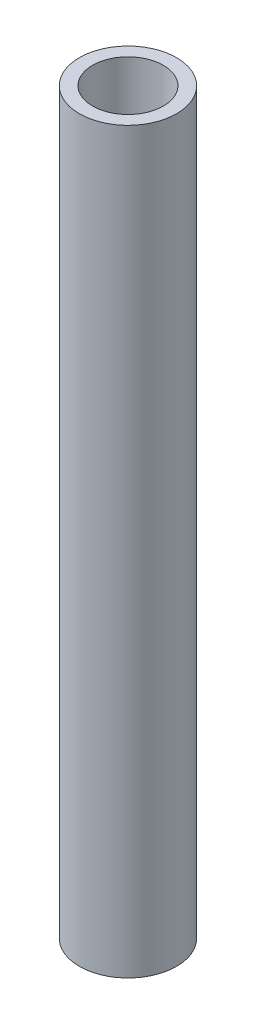
ISO-10303-21;
HEADER;
FILE_DESCRIPTION(('STEP AP214'),'2;1');
FILE_NAME('part.step','',(''),(''),'','','');
FILE_SCHEMA(('AUTOMOTIVE_DESIGN { 1 0 10303 214 1 1 1 1 }'));
ENDSEC;
DATA;
#1=APPLICATION_CONTEXT('core data for automotive mechanical design processes');
#2=APPLICATION_PROTOCOL_DEFINITION('international standard','automotive_design',2000,#1);
#3=PRODUCT_CONTEXT('',#1,'mechanical');
#4=PRODUCT('Part','Part','',(#3));
#5=PRODUCT_RELATED_PRODUCT_CATEGORY('part','',(#4));
#6=PRODUCT_DEFINITION_FORMATION('','',#4);
#7=PRODUCT_DEFINITION_CONTEXT('part definition',#1,'design');
#8=PRODUCT_DEFINITION('design','',#6,#7);
#9=PRODUCT_DEFINITION_SHAPE('','',#8);
#10=(LENGTH_UNIT() NAMED_UNIT(*) SI_UNIT(.MILLI.,.METRE.));
#11=(NAMED_UNIT(*) PLANE_ANGLE_UNIT() SI_UNIT($,.RADIAN.));
#12=(NAMED_UNIT(*) SI_UNIT($,.STERADIAN.) SOLID_ANGLE_UNIT());
#13=UNCERTAINTY_MEASURE_WITH_UNIT(LENGTH_MEASURE(1.E-05),#10,'distance_accuracy_value','');
#14=(GEOMETRIC_REPRESENTATION_CONTEXT(3) GLOBAL_UNCERTAINTY_ASSIGNED_CONTEXT((#13)) GLOBAL_UNIT_ASSIGNED_CONTEXT((#10,
#11,#12)) REPRESENTATION_CONTEXT('',''));
#15=CARTESIAN_POINT('',(0.,0.,0.));
#16=DIRECTION('',(0.,0.,1.));
#17=DIRECTION('',(1.,0.,0.));
#18=AXIS2_PLACEMENT_3D('',#15,#16,#17);
#19=CARTESIAN_POINT('',(0.,127.,0.));
#20=DIRECTION('',(0.,1.,0.));
#21=DIRECTION('',(0.,0.,1.));
#22=AXIS2_PLACEMENT_3D('',#19,#20,#21);
#23=PLANE('',#22);
#24=CARTESIAN_POINT('',(0.,127.,0.));
#25=DIRECTION('',(0.,1.,0.));
#26=DIRECTION('',(0.,0.,1.));
#27=AXIS2_PLACEMENT_3D('',#24,#25,#26);
#28=CIRCLE('',#27,16.7132);
#29=CARTESIAN_POINT('',(0.,127.,16.7132));
#30=VERTEX_POINT('',#29);
#31=EDGE_CURVE('E10',#30,#30,#28,.T.);
#32=ORIENTED_EDGE('',*,*,#31,.T.);
#33=EDGE_LOOP('',(#32));
#34=FACE_BOUND('',#33,.T.);
#35=CARTESIAN_POINT('',(0.,127.,0.));
#36=DIRECTION('',(0.,1.,0.));
#37=DIRECTION('',(0.,0.,1.));
#38=AXIS2_PLACEMENT_3D('',#35,#36,#37);
#39=CIRCLE('',#38,12.1666);
#40=CARTESIAN_POINT('',(0.,127.,12.1666));
#41=VERTEX_POINT('',#40);
#42=EDGE_CURVE('E43',#41,#41,#39,.T.);
#43=ORIENTED_EDGE('',*,*,#42,.F.);
#44=EDGE_LOOP('',(#43));
#45=FACE_BOUND('',#44,.T.);
#46=ADVANCED_FACE('F32',(#34,#45),#23,.T.);
#47=CARTESIAN_POINT('',(0.,-127.,0.));
#48=DIRECTION('',(0.,1.,0.));
#49=DIRECTION('',(0.,0.,1.));
#50=AXIS2_PLACEMENT_3D('',#47,#48,#49);
#51=PLANE('',#50);
#52=CARTESIAN_POINT('',(0.,-127.,0.));
#53=DIRECTION('',(0.,1.,0.));
#54=DIRECTION('',(0.,0.,1.));
#55=AXIS2_PLACEMENT_3D('',#52,#53,#54);
#56=CIRCLE('',#55,16.7132);
#57=CARTESIAN_POINT('',(0.,-127.,16.7132));
#58=VERTEX_POINT('',#57);
#59=EDGE_CURVE('E36',#58,#58,#56,.T.);
#60=ORIENTED_EDGE('',*,*,#59,.F.);
#61=EDGE_LOOP('',(#60));
#62=FACE_BOUND('',#61,.T.);
#63=CARTESIAN_POINT('',(0.,-127.,0.));
#64=DIRECTION('',(0.,1.,0.));
#65=DIRECTION('',(0.,0.,1.));
#66=AXIS2_PLACEMENT_3D('',#63,#64,#65);
#67=CIRCLE('',#66,12.1666);
#68=CARTESIAN_POINT('',(0.,-127.,12.1666));
#69=VERTEX_POINT('',#68);
#70=EDGE_CURVE('E45',#69,#69,#67,.T.);
#71=ORIENTED_EDGE('',*,*,#70,.T.);
#72=EDGE_LOOP('',(#71));
#73=FACE_BOUND('',#72,.T.);
#74=ADVANCED_FACE('F55',(#62,#73),#51,.F.);
#75=CARTESIAN_POINT('',(0.,127.,0.));
#76=DIRECTION('',(0.,-1.,0.));
#77=DIRECTION('',(0.,0.,-1.));
#78=AXIS2_PLACEMENT_3D('',#75,#76,#77);
#79=CYLINDRICAL_SURFACE('',#78,16.7132);
#80=ORIENTED_EDGE('',*,*,#31,.F.);
#81=EDGE_LOOP('',(#80));
#82=FACE_BOUND('',#81,.T.);
#83=ORIENTED_EDGE('',*,*,#59,.T.);
#84=EDGE_LOOP('',(#83));
#85=FACE_BOUND('',#84,.T.);
#86=ADVANCED_FACE('F34',(#82,#85),#79,.T.);
#87=CARTESIAN_POINT('',(0.,127.,0.));
#88=DIRECTION('',(0.,-1.,0.));
#89=DIRECTION('',(0.,0.,-1.));
#90=AXIS2_PLACEMENT_3D('',#87,#88,#89);
#91=CYLINDRICAL_SURFACE('',#90,12.1666);
#92=ORIENTED_EDGE('',*,*,#42,.T.);
#93=EDGE_LOOP('',(#92));
#94=FACE_BOUND('',#93,.T.);
#95=ORIENTED_EDGE('',*,*,#70,.F.);
#96=EDGE_LOOP('',(#95));
#97=FACE_BOUND('',#96,.T.);
#98=ADVANCED_FACE('F51',(#94,#97),#91,.F.);
#99=CLOSED_SHELL('',(#46,#74,#86,#98));
#100=MANIFOLD_SOLID_BREP('B2',#99);
#101=ADVANCED_BREP_SHAPE_REPRESENTATION('',(#18,#100),#14);
#102=SHAPE_DEFINITION_REPRESENTATION(#9,#101);
ENDSEC;
END-ISO-10303-21;
